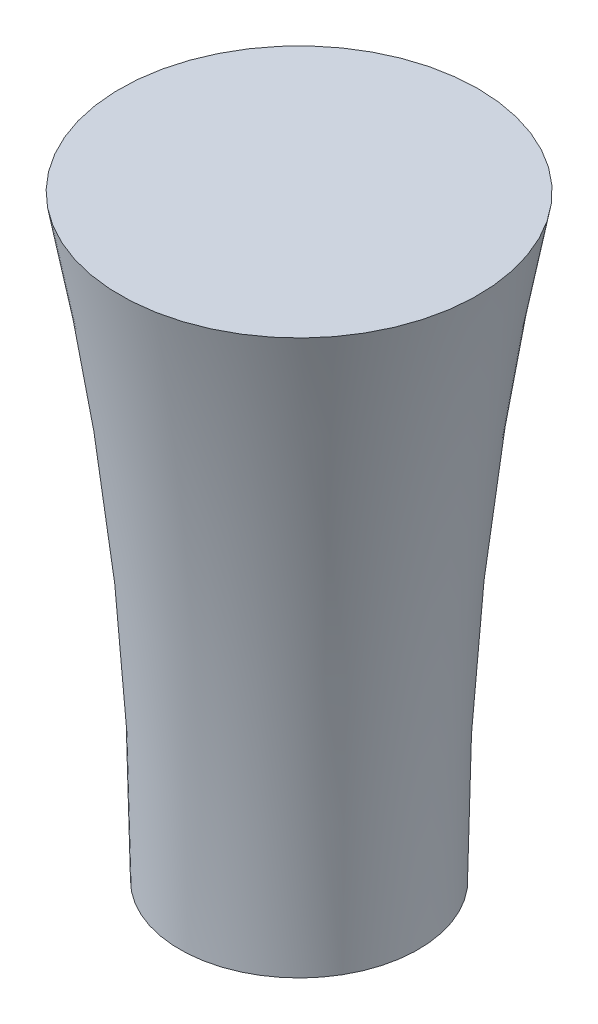
ISO-10303-21;
HEADER;
FILE_DESCRIPTION(('STEP AP214'),'2;1');
FILE_NAME('part.step','',(''),(''),'','','');
FILE_SCHEMA(('AUTOMOTIVE_DESIGN { 1 0 10303 214 1 1 1 1 }'));
ENDSEC;
DATA;
#1=APPLICATION_CONTEXT('core data for automotive mechanical design processes');
#2=APPLICATION_PROTOCOL_DEFINITION('international standard','automotive_design',2000,#1);
#3=PRODUCT_CONTEXT('',#1,'mechanical');
#4=PRODUCT('Part','Part','',(#3));
#5=PRODUCT_RELATED_PRODUCT_CATEGORY('part','',(#4));
#6=PRODUCT_DEFINITION_FORMATION('','',#4);
#7=PRODUCT_DEFINITION_CONTEXT('part definition',#1,'design');
#8=PRODUCT_DEFINITION('design','',#6,#7);
#9=PRODUCT_DEFINITION_SHAPE('','',#8);
#10=(LENGTH_UNIT() NAMED_UNIT(*) SI_UNIT(.MILLI.,.METRE.));
#11=(NAMED_UNIT(*) PLANE_ANGLE_UNIT() SI_UNIT($,.RADIAN.));
#12=(NAMED_UNIT(*) SI_UNIT($,.STERADIAN.) SOLID_ANGLE_UNIT());
#13=UNCERTAINTY_MEASURE_WITH_UNIT(LENGTH_MEASURE(1.E-05),#10,'distance_accuracy_value','');
#14=(GEOMETRIC_REPRESENTATION_CONTEXT(3) GLOBAL_UNCERTAINTY_ASSIGNED_CONTEXT((#13)) GLOBAL_UNIT_ASSIGNED_CONTEXT((#10,
#11,#12)) REPRESENTATION_CONTEXT('',''));
#15=CARTESIAN_POINT('',(0.,0.,0.));
#16=DIRECTION('',(0.,0.,1.));
#17=DIRECTION('',(1.,0.,0.));
#18=AXIS2_PLACEMENT_3D('',#15,#16,#17);
#19=CARTESIAN_POINT('',(0.,0.,0.));
#20=DIRECTION('',(0.,-1.,0.));
#21=DIRECTION('',(0.,0.,-1.));
#22=AXIS2_PLACEMENT_3D('',#19,#20,#21);
#23=PLANE('',#22);
#24=CARTESIAN_POINT('',(0.,0.,0.));
#25=DIRECTION('',(0.,-1.,0.));
#26=DIRECTION('',(0.,0.,-1.));
#27=AXIS2_PLACEMENT_3D('',#24,#25,#26);
#28=CIRCLE('',#27,0.999999999999997);
#29=CARTESIAN_POINT('',(0.,0.,-0.999999999999997));
#30=VERTEX_POINT('',#29);
#31=EDGE_CURVE('E41',#30,#30,#28,.T.);
#32=ORIENTED_EDGE('',*,*,#31,.T.);
#33=EDGE_LOOP('',(#32));
#34=FACE_BOUND('',#33,.T.);
#35=ADVANCED_FACE('F34',(#34),#23,.T.);
#36=CARTESIAN_POINT('',(0.,5.,0.));
#37=DIRECTION('',(0.,1.,0.));
#38=DIRECTION('',(0.,0.,1.));
#39=AXIS2_PLACEMENT_3D('',#36,#37,#38);
#40=PLANE('',#39);
#41=CARTESIAN_POINT('',(0.,5.,0.));
#42=DIRECTION('',(0.,-1.,0.));
#43=DIRECTION('',(0.,0.,-1.));
#44=AXIS2_PLACEMENT_3D('',#41,#42,#43);
#45=CIRCLE('',#44,1.5);
#46=CARTESIAN_POINT('',(0.,5.,-1.5));
#47=VERTEX_POINT('',#46);
#48=EDGE_CURVE('E10',#47,#47,#45,.T.);
#49=ORIENTED_EDGE('',*,*,#48,.F.);
#50=EDGE_LOOP('',(#49));
#51=FACE_BOUND('',#50,.T.);
#52=ADVANCED_FACE('F51',(#51),#40,.T.);
#53=CARTESIAN_POINT('',(0.,0.,0.));
#54=DIRECTION('',(0.,-1.,0.));
#55=DIRECTION('',(0.,0.,-1.));
#56=AXIS2_PLACEMENT_3D('',#53,#54,#55);
#57=TOROIDAL_SURFACE('',#56,26.2499999999994,25.2499999999994);
#58=ORIENTED_EDGE('',*,*,#48,.T.);
#59=EDGE_LOOP('',(#58));
#60=FACE_BOUND('',#59,.T.);
#61=ORIENTED_EDGE('',*,*,#31,.F.);
#62=EDGE_LOOP('',(#61));
#63=FACE_BOUND('',#62,.T.);
#64=ADVANCED_FACE('F49',(#60,#63),#57,.F.);
#65=CLOSED_SHELL('',(#35,#52,#64));
#66=MANIFOLD_SOLID_BREP('B2',#65);
#67=ADVANCED_BREP_SHAPE_REPRESENTATION('',(#18,#66),#14);
#68=SHAPE_DEFINITION_REPRESENTATION(#9,#67);
ENDSEC;
END-ISO-10303-21;
